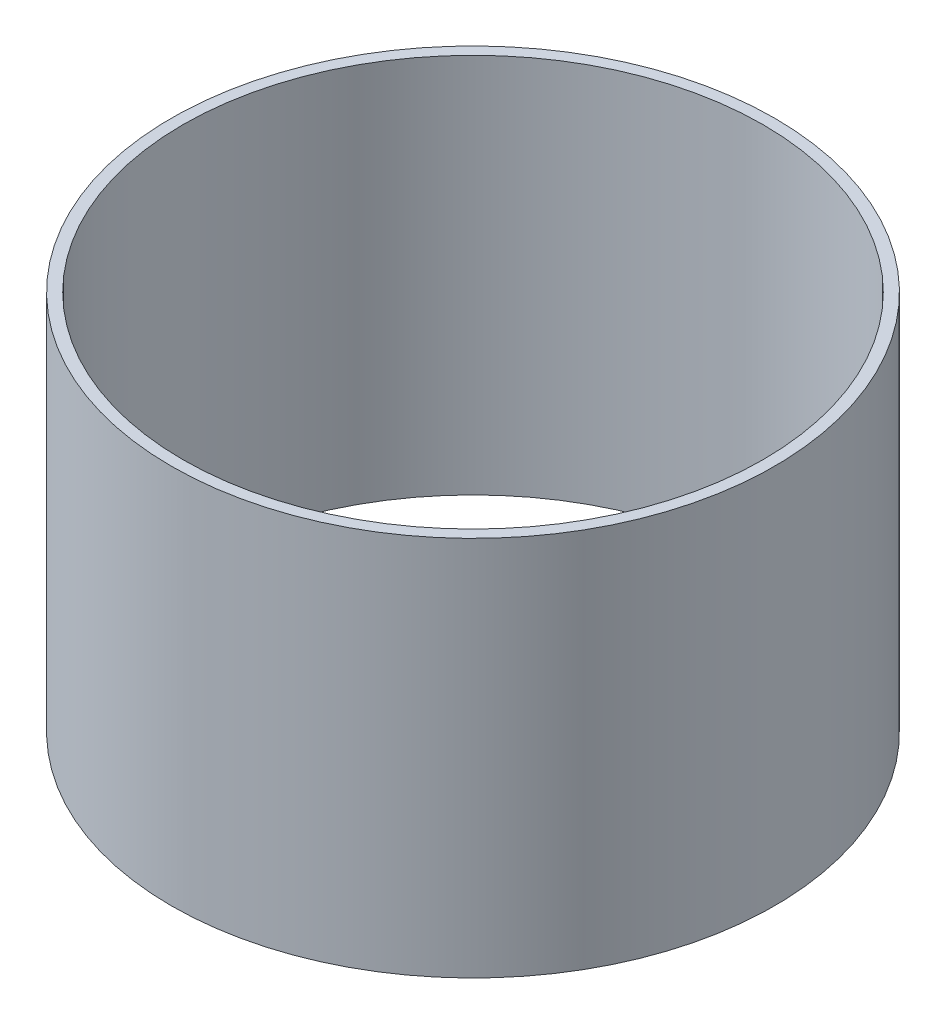
ISO-10303-21;
HEADER;
FILE_DESCRIPTION(('STEP AP214'),'2;1');
FILE_NAME('part.step','',(''),(''),'','','');
FILE_SCHEMA(('AUTOMOTIVE_DESIGN { 1 0 10303 214 1 1 1 1 }'));
ENDSEC;
DATA;
#1=APPLICATION_CONTEXT('core data for automotive mechanical design processes');
#2=APPLICATION_PROTOCOL_DEFINITION('international standard','automotive_design',2000,#1);
#3=PRODUCT_CONTEXT('',#1,'mechanical');
#4=PRODUCT('Part','Part','',(#3));
#5=PRODUCT_RELATED_PRODUCT_CATEGORY('part','',(#4));
#6=PRODUCT_DEFINITION_FORMATION('','',#4);
#7=PRODUCT_DEFINITION_CONTEXT('part definition',#1,'design');
#8=PRODUCT_DEFINITION('design','',#6,#7);
#9=PRODUCT_DEFINITION_SHAPE('','',#8);
#10=(LENGTH_UNIT() NAMED_UNIT(*) SI_UNIT(.MILLI.,.METRE.));
#11=(NAMED_UNIT(*) PLANE_ANGLE_UNIT() SI_UNIT($,.RADIAN.));
#12=(NAMED_UNIT(*) SI_UNIT($,.STERADIAN.) SOLID_ANGLE_UNIT());
#13=UNCERTAINTY_MEASURE_WITH_UNIT(LENGTH_MEASURE(1.E-05),#10,'distance_accuracy_value','');
#14=(GEOMETRIC_REPRESENTATION_CONTEXT(3) GLOBAL_UNCERTAINTY_ASSIGNED_CONTEXT((#13)) GLOBAL_UNIT_ASSIGNED_CONTEXT((#10,
#11,#12)) REPRESENTATION_CONTEXT('',''));
#15=CARTESIAN_POINT('',(0.,0.,0.));
#16=DIRECTION('',(0.,0.,1.));
#17=DIRECTION('',(1.,0.,0.));
#18=AXIS2_PLACEMENT_3D('',#15,#16,#17);
#19=CARTESIAN_POINT('',(0.,50.,0.));
#20=DIRECTION('',(0.,1.,0.));
#21=DIRECTION('',(0.,0.,1.));
#22=AXIS2_PLACEMENT_3D('',#19,#20,#21);
#23=PLANE('',#22);
#24=CARTESIAN_POINT('',(0.,50.,0.));
#25=DIRECTION('',(0.,1.,0.));
#26=DIRECTION('',(0.,0.,1.));
#27=AXIS2_PLACEMENT_3D('',#24,#25,#26);
#28=CIRCLE('',#27,39.6);
#29=CARTESIAN_POINT('',(0.,50.,39.6));
#30=VERTEX_POINT('',#29);
#31=EDGE_CURVE('E10',#30,#30,#28,.T.);
#32=ORIENTED_EDGE('',*,*,#31,.T.);
#33=EDGE_LOOP('',(#32));
#34=FACE_BOUND('',#33,.T.);
#35=CARTESIAN_POINT('',(0.,50.,0.));
#36=DIRECTION('',(0.,1.,0.));
#37=DIRECTION('',(0.,0.,1.));
#38=AXIS2_PLACEMENT_3D('',#35,#36,#37);
#39=CIRCLE('',#38,38.1);
#40=CARTESIAN_POINT('',(0.,50.,38.1));
#41=VERTEX_POINT('',#40);
#42=EDGE_CURVE('E43',#41,#41,#39,.T.);
#43=ORIENTED_EDGE('',*,*,#42,.F.);
#44=EDGE_LOOP('',(#43));
#45=FACE_BOUND('',#44,.T.);
#46=ADVANCED_FACE('F32',(#34,#45),#23,.T.);
#47=CARTESIAN_POINT('',(0.,0.,0.));
#48=DIRECTION('',(0.,1.,0.));
#49=DIRECTION('',(0.,0.,1.));
#50=AXIS2_PLACEMENT_3D('',#47,#48,#49);
#51=PLANE('',#50);
#52=CARTESIAN_POINT('',(0.,0.,0.));
#53=DIRECTION('',(0.,1.,0.));
#54=DIRECTION('',(0.,0.,1.));
#55=AXIS2_PLACEMENT_3D('',#52,#53,#54);
#56=CIRCLE('',#55,39.6);
#57=CARTESIAN_POINT('',(0.,0.,39.6));
#58=VERTEX_POINT('',#57);
#59=EDGE_CURVE('E36',#58,#58,#56,.T.);
#60=ORIENTED_EDGE('',*,*,#59,.F.);
#61=EDGE_LOOP('',(#60));
#62=FACE_BOUND('',#61,.T.);
#63=CARTESIAN_POINT('',(0.,0.,0.));
#64=DIRECTION('',(0.,1.,0.));
#65=DIRECTION('',(0.,0.,1.));
#66=AXIS2_PLACEMENT_3D('',#63,#64,#65);
#67=CIRCLE('',#66,38.1);
#68=CARTESIAN_POINT('',(0.,0.,38.1));
#69=VERTEX_POINT('',#68);
#70=EDGE_CURVE('E45',#69,#69,#67,.T.);
#71=ORIENTED_EDGE('',*,*,#70,.T.);
#72=EDGE_LOOP('',(#71));
#73=FACE_BOUND('',#72,.T.);
#74=ADVANCED_FACE('F55',(#62,#73),#51,.F.);
#75=CARTESIAN_POINT('',(0.,50.,0.));
#76=DIRECTION('',(0.,-1.,0.));
#77=DIRECTION('',(0.,0.,-1.));
#78=AXIS2_PLACEMENT_3D('',#75,#76,#77);
#79=CYLINDRICAL_SURFACE('',#78,39.6);
#80=ORIENTED_EDGE('',*,*,#31,.F.);
#81=EDGE_LOOP('',(#80));
#82=FACE_BOUND('',#81,.T.);
#83=ORIENTED_EDGE('',*,*,#59,.T.);
#84=EDGE_LOOP('',(#83));
#85=FACE_BOUND('',#84,.T.);
#86=ADVANCED_FACE('F34',(#82,#85),#79,.T.);
#87=CARTESIAN_POINT('',(0.,50.,0.));
#88=DIRECTION('',(0.,-1.,0.));
#89=DIRECTION('',(0.,0.,-1.));
#90=AXIS2_PLACEMENT_3D('',#87,#88,#89);
#91=CYLINDRICAL_SURFACE('',#90,38.1);
#92=ORIENTED_EDGE('',*,*,#42,.T.);
#93=EDGE_LOOP('',(#92));
#94=FACE_BOUND('',#93,.T.);
#95=ORIENTED_EDGE('',*,*,#70,.F.);
#96=EDGE_LOOP('',(#95));
#97=FACE_BOUND('',#96,.T.);
#98=ADVANCED_FACE('F51',(#94,#97),#91,.F.);
#99=CLOSED_SHELL('',(#46,#74,#86,#98));
#100=MANIFOLD_SOLID_BREP('B2',#99);
#101=ADVANCED_BREP_SHAPE_REPRESENTATION('',(#18,#100),#14);
#102=SHAPE_DEFINITION_REPRESENTATION(#9,#101);
ENDSEC;
END-ISO-10303-21;
